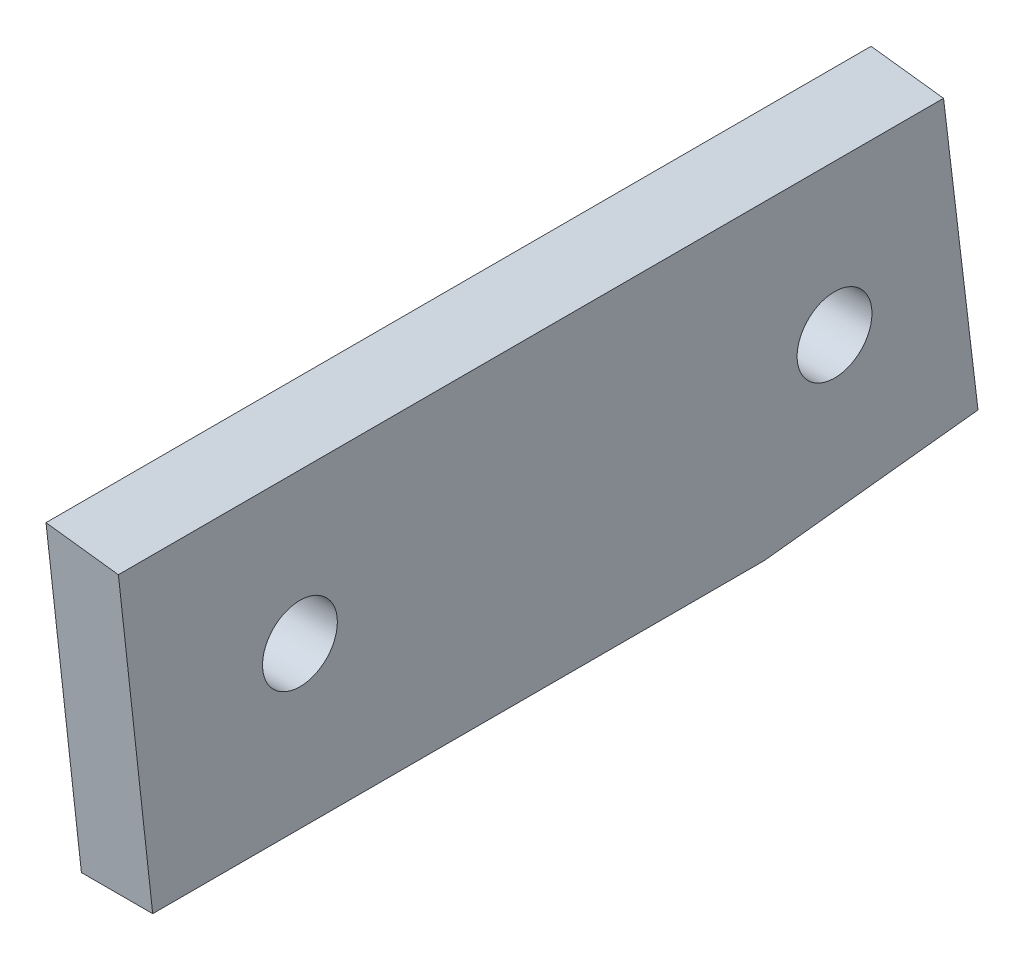
ISO-10303-21;
HEADER;
FILE_DESCRIPTION(('STEP AP214'),'2;1');
FILE_NAME('part.step','',(''),(''),'','','');
FILE_SCHEMA(('AUTOMOTIVE_DESIGN { 1 0 10303 214 1 1 1 1 }'));
ENDSEC;
DATA;
#1=APPLICATION_CONTEXT('core data for automotive mechanical design processes');
#2=APPLICATION_PROTOCOL_DEFINITION('international standard','automotive_design',2000,#1);
#3=PRODUCT_CONTEXT('',#1,'mechanical');
#4=PRODUCT('Part','Part','',(#3));
#5=PRODUCT_RELATED_PRODUCT_CATEGORY('part','',(#4));
#6=PRODUCT_DEFINITION_FORMATION('','',#4);
#7=PRODUCT_DEFINITION_CONTEXT('part definition',#1,'design');
#8=PRODUCT_DEFINITION('design','',#6,#7);
#9=PRODUCT_DEFINITION_SHAPE('','',#8);
#10=(LENGTH_UNIT() NAMED_UNIT(*) SI_UNIT(.MILLI.,.METRE.));
#11=(NAMED_UNIT(*) PLANE_ANGLE_UNIT() SI_UNIT($,.RADIAN.));
#12=(NAMED_UNIT(*) SI_UNIT($,.STERADIAN.) SOLID_ANGLE_UNIT());
#13=UNCERTAINTY_MEASURE_WITH_UNIT(LENGTH_MEASURE(1.E-05),#10,'distance_accuracy_value','');
#14=(GEOMETRIC_REPRESENTATION_CONTEXT(3) GLOBAL_UNCERTAINTY_ASSIGNED_CONTEXT((#13)) GLOBAL_UNIT_ASSIGNED_CONTEXT((#10,
#11,#12)) REPRESENTATION_CONTEXT('',''));
#15=CARTESIAN_POINT('',(0.,0.,0.));
#16=DIRECTION('',(0.,0.,1.));
#17=DIRECTION('',(1.,0.,0.));
#18=AXIS2_PLACEMENT_3D('',#15,#16,#17);
#19=CARTESIAN_POINT('',(0.,0.,48.3));
#20=DIRECTION('',(1.,0.,0.));
#21=DIRECTION('',(0.,0.,-1.));
#22=AXIS2_PLACEMENT_3D('',#19,#20,#21);
#23=PLANE('',#22);
#24=CARTESIAN_POINT('',(0.,9.,8.05));
#25=DIRECTION('',(1.,0.,0.));
#26=DIRECTION('',(0.,0.,-1.));
#27=AXIS2_PLACEMENT_3D('',#24,#25,#26);
#28=CIRCLE('',#27,2.1);
#29=CARTESIAN_POINT('',(0.,9.,5.94999999999999));
#30=VERTEX_POINT('',#29);
#31=EDGE_CURVE('E121',#30,#30,#28,.T.);
#32=ORIENTED_EDGE('',*,*,#31,.T.);
#33=EDGE_LOOP('',(#32));
#34=FACE_BOUND('',#33,.T.);
#35=CARTESIAN_POINT('',(0.,8.99999999999999,38.05));
#36=DIRECTION('',(1.,0.,0.));
#37=DIRECTION('',(0.,0.,-1.));
#38=AXIS2_PLACEMENT_3D('',#35,#36,#37);
#39=CIRCLE('',#38,2.1);
#40=CARTESIAN_POINT('',(0.,8.99999999999999,35.95));
#41=VERTEX_POINT('',#40);
#42=EDGE_CURVE('E127',#41,#41,#39,.T.);
#43=ORIENTED_EDGE('',*,*,#42,.T.);
#44=EDGE_LOOP('',(#43));
#45=FACE_BOUND('',#44,.T.);
#46=DIRECTION('',(0.,0.,-1.));
#47=VECTOR('',#46,1.);
#48=CARTESIAN_POINT('',(0.,18.,48.3));
#49=LINE('',#48,#47);
#50=CARTESIAN_POINT('',(0.,18.,48.3));
#51=VERTEX_POINT('',#50);
#52=CARTESIAN_POINT('',(0.,18.,2.));
#53=VERTEX_POINT('',#52);
#54=EDGE_CURVE('E102',#51,#53,#49,.T.);
#55=ORIENTED_EDGE('',*,*,#54,.T.);
#56=DIRECTION('',(0.,0.992884038979238,0.119085201180814));
#57=VECTOR('',#56,1.);
#58=CARTESIAN_POINT('',(0.,1.32481233378973,0.));
#59=LINE('',#58,#57);
#60=CARTESIAN_POINT('',(0.,1.32481233378973,0.));
#61=VERTEX_POINT('',#60);
#62=EDGE_CURVE('E88',#61,#53,#59,.T.);
#63=ORIENTED_EDGE('',*,*,#62,.F.);
#64=DIRECTION('',(0.,0.109734311091038,-0.99396095545518));
#65=VECTOR('',#64,1.);
#66=CARTESIAN_POINT('',(0.,1.32481233378973,0.));
#67=LINE('',#66,#65);
#68=CARTESIAN_POINT('',(0.,0.,12.));
#69=VERTEX_POINT('',#68);
#70=EDGE_CURVE('E100',#69,#61,#67,.T.);
#71=ORIENTED_EDGE('',*,*,#70,.F.);
#72=DIRECTION('',(0.,0.,-1.));
#73=VECTOR('',#72,1.);
#74=CARTESIAN_POINT('',(0.,0.,48.3));
#75=LINE('',#74,#73);
#76=CARTESIAN_POINT('',(0.,0.,46.3127814993154));
#77=VERTEX_POINT('',#76);
#78=EDGE_CURVE('E11',#77,#69,#75,.T.);
#79=ORIENTED_EDGE('',*,*,#78,.F.);
#80=DIRECTION('',(0.,-0.99396095545518,-0.109734311091039));
#81=VECTOR('',#80,1.);
#82=CARTESIAN_POINT('',(0.,18.,48.3));
#83=LINE('',#82,#81);
#84=EDGE_CURVE('E93',#51,#77,#83,.T.);
#85=ORIENTED_EDGE('',*,*,#84,.F.);
#86=EDGE_LOOP('',(#55,#63,#71,#79,#85));
#87=FACE_BOUND('',#86,.T.);
#88=ADVANCED_FACE('F39',(#34,#45,#87),#23,.F.);
#89=CARTESIAN_POINT('',(0.,0.,48.3));
#90=DIRECTION('',(0.,1.,0.));
#91=DIRECTION('',(0.,0.,1.));
#92=AXIS2_PLACEMENT_3D('',#89,#90,#91);
#93=PLANE('',#92);
#94=ORIENTED_EDGE('',*,*,#78,.T.);
#95=DIRECTION('',(-1.,0.,0.));
#96=VECTOR('',#95,1.);
#97=CARTESIAN_POINT('',(4.,0.,12.));
#98=LINE('',#97,#96);
#99=CARTESIAN_POINT('',(4.,0.,12.));
#100=VERTEX_POINT('',#99);
#101=EDGE_CURVE('E94',#100,#69,#98,.T.);
#102=ORIENTED_EDGE('',*,*,#101,.F.);
#103=DIRECTION('',(0.,0.,-1.));
#104=VECTOR('',#103,1.);
#105=CARTESIAN_POINT('',(4.,0.,48.3));
#106=LINE('',#105,#104);
#107=CARTESIAN_POINT('',(4.,0.,46.3127814993154));
#108=VERTEX_POINT('',#107);
#109=EDGE_CURVE('E46',#108,#100,#106,.T.);
#110=ORIENTED_EDGE('',*,*,#109,.F.);
#111=DIRECTION('',(-1.,0.,0.));
#112=VECTOR('',#111,1.);
#113=CARTESIAN_POINT('',(4.,0.,46.3127814993154));
#114=LINE('',#113,#112);
#115=EDGE_CURVE('E59',#108,#77,#114,.T.);
#116=ORIENTED_EDGE('',*,*,#115,.T.);
#117=EDGE_LOOP('',(#94,#102,#110,#116));
#118=FACE_BOUND('',#117,.T.);
#119=ADVANCED_FACE('F139',(#118),#93,.F.);
#120=CARTESIAN_POINT('',(4.,0.,48.3));
#121=DIRECTION('',(-1.,0.,0.));
#122=DIRECTION('',(0.,0.,1.));
#123=AXIS2_PLACEMENT_3D('',#120,#121,#122);
#124=PLANE('',#123);
#125=CARTESIAN_POINT('',(4.,9.,8.05));
#126=DIRECTION('',(1.,0.,0.));
#127=DIRECTION('',(0.,0.,-1.));
#128=AXIS2_PLACEMENT_3D('',#125,#126,#127);
#129=CIRCLE('',#128,2.09999999999999);
#130=CARTESIAN_POINT('',(4.,9.,5.95000000000001));
#131=VERTEX_POINT('',#130);
#132=EDGE_CURVE('E118',#131,#131,#129,.T.);
#133=ORIENTED_EDGE('',*,*,#132,.F.);
#134=EDGE_LOOP('',(#133));
#135=FACE_BOUND('',#134,.T.);
#136=CARTESIAN_POINT('',(4.,8.99999999999999,38.05));
#137=DIRECTION('',(1.,0.,0.));
#138=DIRECTION('',(0.,0.,-1.));
#139=AXIS2_PLACEMENT_3D('',#136,#137,#138);
#140=CIRCLE('',#139,2.09999999999999);
#141=CARTESIAN_POINT('',(4.,8.99999999999999,35.95));
#142=VERTEX_POINT('',#141);
#143=EDGE_CURVE('E124',#142,#142,#140,.T.);
#144=ORIENTED_EDGE('',*,*,#143,.F.);
#145=EDGE_LOOP('',(#144));
#146=FACE_BOUND('',#145,.T.);
#147=DIRECTION('',(0.,0.109734311091038,-0.99396095545518));
#148=VECTOR('',#147,1.);
#149=CARTESIAN_POINT('',(4.,1.32481233378973,0.));
#150=LINE('',#149,#148);
#151=CARTESIAN_POINT('',(4.,1.32481233378973,0.));
#152=VERTEX_POINT('',#151);
#153=EDGE_CURVE('E107',#100,#152,#150,.T.);
#154=ORIENTED_EDGE('',*,*,#153,.T.);
#155=DIRECTION('',(0.,0.992884038979238,0.119085201180814));
#156=VECTOR('',#155,1.);
#157=CARTESIAN_POINT('',(4.,1.32481233378973,0.));
#158=LINE('',#157,#156);
#159=CARTESIAN_POINT('',(4.,17.4378366611904,1.9325748711124));
#160=VERTEX_POINT('',#159);
#161=EDGE_CURVE('E74',#152,#160,#158,.T.);
#162=ORIENTED_EDGE('',*,*,#161,.T.);
#163=DIRECTION('',(0.,0.,-1.));
#164=VECTOR('',#163,1.);
#165=CARTESIAN_POINT('',(4.,17.4378366611904,48.3));
#166=LINE('',#165,#164);
#167=CARTESIAN_POINT('',(4.,17.4378366611904,48.2379365895951));
#168=VERTEX_POINT('',#167);
#169=EDGE_CURVE('E131',#168,#160,#166,.T.);
#170=ORIENTED_EDGE('',*,*,#169,.F.);
#171=DIRECTION('',(0.,-0.99396095545518,-0.109734311091039));
#172=VECTOR('',#171,1.);
#173=CARTESIAN_POINT('',(4.,18.,48.3));
#174=LINE('',#173,#172);
#175=EDGE_CURVE('E53',#168,#108,#174,.T.);
#176=ORIENTED_EDGE('',*,*,#175,.T.);
#177=ORIENTED_EDGE('',*,*,#109,.T.);
#178=EDGE_LOOP('',(#154,#162,#170,#176,#177));
#179=FACE_BOUND('',#178,.T.);
#180=ADVANCED_FACE('F136',(#135,#146,#179),#124,.F.);
#181=CARTESIAN_POINT('',(0.,18.,48.3));
#182=DIRECTION('',(-0.139173100960066,-0.99026806874157,0.));
#183=DIRECTION('',(0.99026806874157,-0.139173100960066,0.));
#184=AXIS2_PLACEMENT_3D('',#181,#182,#183);
#185=PLANE('',#184);
#186=ORIENTED_EDGE('',*,*,#169,.T.);
#187=DIRECTION('',(-0.990130137967246,0.139153716053911,0.0166899130419846));
#188=VECTOR('',#187,1.);
#189=CARTESIAN_POINT('',(-0.765116107305267,18.1075300563649,2.01289701303726));
#190=LINE('',#189,#188);
#191=EDGE_CURVE('E108',#160,#53,#190,.T.);
#192=ORIENTED_EDGE('',*,*,#191,.T.);
#193=ORIENTED_EDGE('',*,*,#54,.F.);
#194=DIRECTION('',(0.990151198825121,-0.139156675964457,-0.0153630400539079));
#195=VECTOR('',#194,1.);
#196=CARTESIAN_POINT('',(0.,18.,48.3));
#197=LINE('',#196,#195);
#198=EDGE_CURVE('E66',#51,#168,#197,.T.);
#199=ORIENTED_EDGE('',*,*,#198,.T.);
#200=EDGE_LOOP('',(#186,#192,#193,#199));
#201=FACE_BOUND('',#200,.T.);
#202=ADVANCED_FACE('F141',(#201),#185,.F.);
#203=CARTESIAN_POINT('',(4.,8.99999999999999,38.05));
#204=DIRECTION('',(1.,0.,0.));
#205=DIRECTION('',(0.,0.,-1.));
#206=AXIS2_PLACEMENT_3D('',#203,#204,#205);
#207=CYLINDRICAL_SURFACE('',#206,2.09999999999999);
#208=ORIENTED_EDGE('',*,*,#42,.F.);
#209=EDGE_LOOP('',(#208));
#210=FACE_BOUND('',#209,.T.);
#211=ORIENTED_EDGE('',*,*,#143,.T.);
#212=EDGE_LOOP('',(#211));
#213=FACE_BOUND('',#212,.T.);
#214=ADVANCED_FACE('F144',(#210,#213),#207,.F.);
#215=CARTESIAN_POINT('',(4.,9.,8.05));
#216=DIRECTION('',(1.,0.,0.));
#217=DIRECTION('',(0.,0.,-1.));
#218=AXIS2_PLACEMENT_3D('',#215,#216,#217);
#219=CYLINDRICAL_SURFACE('',#218,2.09999999999999);
#220=ORIENTED_EDGE('',*,*,#31,.F.);
#221=EDGE_LOOP('',(#220));
#222=FACE_BOUND('',#221,.T.);
#223=ORIENTED_EDGE('',*,*,#132,.T.);
#224=EDGE_LOOP('',(#223));
#225=FACE_BOUND('',#224,.T.);
#226=ADVANCED_FACE('F150',(#222,#225),#219,.F.);
#227=CARTESIAN_POINT('',(4.,18.,48.3));
#228=DIRECTION('',(0.,0.109734311091039,-0.99396095545518));
#229=DIRECTION('',(0.,0.993960955455181,0.109734311091039));
#230=AXIS2_PLACEMENT_3D('',#227,#228,#229);
#231=PLANE('',#230);
#232=ORIENTED_EDGE('',*,*,#84,.T.);
#233=ORIENTED_EDGE('',*,*,#115,.F.);
#234=ORIENTED_EDGE('',*,*,#175,.F.);
#235=ORIENTED_EDGE('',*,*,#198,.F.);
#236=EDGE_LOOP('',(#232,#233,#234,#235));
#237=FACE_BOUND('',#236,.T.);
#238=ADVANCED_FACE('F169',(#237),#231,.F.);
#239=CARTESIAN_POINT('',(4.,1.32481233378973,0.));
#240=DIRECTION('',(0.,0.993960955455181,0.109734311091038));
#241=DIRECTION('',(0.,-0.109734311091038,0.993960955455181));
#242=AXIS2_PLACEMENT_3D('',#239,#240,#241);
#243=PLANE('',#242);
#244=ORIENTED_EDGE('',*,*,#70,.T.);
#245=DIRECTION('',(-1.,0.,0.));
#246=VECTOR('',#245,1.);
#247=CARTESIAN_POINT('',(4.,1.32481233378973,0.));
#248=LINE('',#247,#246);
#249=EDGE_CURVE('E85',#152,#61,#248,.T.);
#250=ORIENTED_EDGE('',*,*,#249,.F.);
#251=ORIENTED_EDGE('',*,*,#153,.F.);
#252=ORIENTED_EDGE('',*,*,#101,.T.);
#253=EDGE_LOOP('',(#244,#250,#251,#252));
#254=FACE_BOUND('',#253,.T.);
#255=ADVANCED_FACE('F105',(#254),#243,.F.);
#256=CARTESIAN_POINT('',(4.,1.32481233378973,0.));
#257=DIRECTION('',(0.,-0.119085201180814,0.992884038979238));
#258=DIRECTION('',(0.,-0.992884038979238,-0.119085201180814));
#259=AXIS2_PLACEMENT_3D('',#256,#257,#258);
#260=PLANE('',#259);
#261=ORIENTED_EDGE('',*,*,#161,.F.);
#262=ORIENTED_EDGE('',*,*,#249,.T.);
#263=ORIENTED_EDGE('',*,*,#62,.T.);
#264=ORIENTED_EDGE('',*,*,#191,.F.);
#265=EDGE_LOOP('',(#261,#262,#263,#264));
#266=FACE_BOUND('',#265,.T.);
#267=ADVANCED_FACE('F87',(#266),#260,.F.);
#268=CLOSED_SHELL('',(#88,#119,#180,#202,#214,#226,#238,#255,#267));
#269=MANIFOLD_SOLID_BREP('B2',#268);
#270=ADVANCED_BREP_SHAPE_REPRESENTATION('',(#18,#269),#14);
#271=SHAPE_DEFINITION_REPRESENTATION(#9,#270);
ENDSEC;
END-ISO-10303-21;
